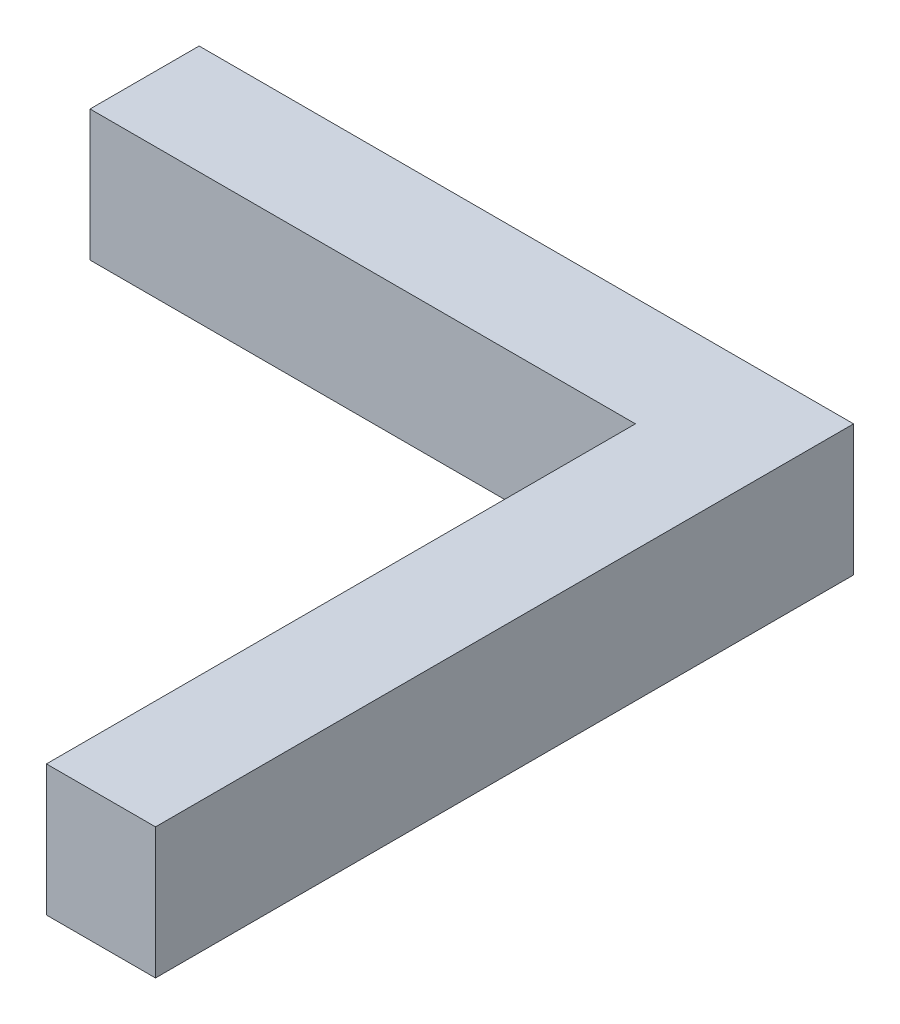
ISO-10303-21;
HEADER;
FILE_DESCRIPTION(('STEP AP214'),'2;1');
FILE_NAME('part.step','',(''),(''),'','','');
FILE_SCHEMA(('AUTOMOTIVE_DESIGN { 1 0 10303 214 1 1 1 1 }'));
ENDSEC;
DATA;
#1=APPLICATION_CONTEXT('core data for automotive mechanical design processes');
#2=APPLICATION_PROTOCOL_DEFINITION('international standard','automotive_design',2000,#1);
#3=PRODUCT_CONTEXT('',#1,'mechanical');
#4=PRODUCT('Part','Part','',(#3));
#5=PRODUCT_RELATED_PRODUCT_CATEGORY('part','',(#4));
#6=PRODUCT_DEFINITION_FORMATION('','',#4);
#7=PRODUCT_DEFINITION_CONTEXT('part definition',#1,'design');
#8=PRODUCT_DEFINITION('design','',#6,#7);
#9=PRODUCT_DEFINITION_SHAPE('','',#8);
#10=(LENGTH_UNIT() NAMED_UNIT(*) SI_UNIT(.MILLI.,.METRE.));
#11=(NAMED_UNIT(*) PLANE_ANGLE_UNIT() SI_UNIT($,.RADIAN.));
#12=(NAMED_UNIT(*) SI_UNIT($,.STERADIAN.) SOLID_ANGLE_UNIT());
#13=UNCERTAINTY_MEASURE_WITH_UNIT(LENGTH_MEASURE(1.E-05),#10,'distance_accuracy_value','');
#14=(GEOMETRIC_REPRESENTATION_CONTEXT(3) GLOBAL_UNCERTAINTY_ASSIGNED_CONTEXT((#13)) GLOBAL_UNIT_ASSIGNED_CONTEXT((#10,
#11,#12)) REPRESENTATION_CONTEXT('',''));
#15=CARTESIAN_POINT('',(0.,0.,0.));
#16=DIRECTION('',(0.,0.,1.));
#17=DIRECTION('',(1.,0.,0.));
#18=AXIS2_PLACEMENT_3D('',#15,#16,#17);
#19=CARTESIAN_POINT('',(0.,12.,10.));
#20=DIRECTION('',(1.,0.,0.));
#21=DIRECTION('',(0.,0.,-1.));
#22=AXIS2_PLACEMENT_3D('',#19,#20,#21);
#23=PLANE('',#22);
#24=DIRECTION('',(0.,0.,1.));
#25=VECTOR('',#24,1.);
#26=CARTESIAN_POINT('',(0.,0.,10.));
#27=LINE('',#26,#25);
#28=CARTESIAN_POINT('',(0.,0.,0.));
#29=VERTEX_POINT('',#28);
#30=CARTESIAN_POINT('',(0.,0.,10.));
#31=VERTEX_POINT('',#30);
#32=EDGE_CURVE('E117',#29,#31,#27,.T.);
#33=ORIENTED_EDGE('',*,*,#32,.T.);
#34=DIRECTION('',(0.,-1.,0.));
#35=VECTOR('',#34,1.);
#36=CARTESIAN_POINT('',(0.,12.,10.));
#37=LINE('',#36,#35);
#38=CARTESIAN_POINT('',(0.,12.,10.));
#39=VERTEX_POINT('',#38);
#40=EDGE_CURVE('E11',#39,#31,#37,.T.);
#41=ORIENTED_EDGE('',*,*,#40,.F.);
#42=DIRECTION('',(0.,0.,1.));
#43=VECTOR('',#42,1.);
#44=CARTESIAN_POINT('',(0.,12.,10.));
#45=LINE('',#44,#43);
#46=CARTESIAN_POINT('',(0.,12.,0.));
#47=VERTEX_POINT('',#46);
#48=EDGE_CURVE('E127',#47,#39,#45,.T.);
#49=ORIENTED_EDGE('',*,*,#48,.F.);
#50=DIRECTION('',(0.,-1.,0.));
#51=VECTOR('',#50,1.);
#52=CARTESIAN_POINT('',(0.,12.,0.));
#53=LINE('',#52,#51);
#54=EDGE_CURVE('E113',#47,#29,#53,.T.);
#55=ORIENTED_EDGE('',*,*,#54,.T.);
#56=EDGE_LOOP('',(#33,#41,#49,#55));
#57=FACE_BOUND('',#56,.T.);
#58=ADVANCED_FACE('F33',(#57),#23,.F.);
#59=CARTESIAN_POINT('',(50.,12.,10.));
#60=DIRECTION('',(0.,0.,-1.));
#61=DIRECTION('',(-1.,0.,0.));
#62=AXIS2_PLACEMENT_3D('',#59,#60,#61);
#63=PLANE('',#62);
#64=DIRECTION('',(1.,0.,0.));
#65=VECTOR('',#64,1.);
#66=CARTESIAN_POINT('',(50.,0.,10.));
#67=LINE('',#66,#65);
#68=CARTESIAN_POINT('',(50.,0.,10.));
#69=VERTEX_POINT('',#68);
#70=EDGE_CURVE('E120',#31,#69,#67,.T.);
#71=ORIENTED_EDGE('',*,*,#70,.T.);
#72=DIRECTION('',(0.,-1.,0.));
#73=VECTOR('',#72,1.);
#74=CARTESIAN_POINT('',(50.,12.,10.));
#75=LINE('',#74,#73);
#76=CARTESIAN_POINT('',(50.,12.,10.));
#77=VERTEX_POINT('',#76);
#78=EDGE_CURVE('E41',#77,#69,#75,.T.);
#79=ORIENTED_EDGE('',*,*,#78,.F.);
#80=DIRECTION('',(1.,0.,0.));
#81=VECTOR('',#80,1.);
#82=CARTESIAN_POINT('',(50.,12.,10.));
#83=LINE('',#82,#81);
#84=EDGE_CURVE('E86',#39,#77,#83,.T.);
#85=ORIENTED_EDGE('',*,*,#84,.F.);
#86=ORIENTED_EDGE('',*,*,#40,.T.);
#87=EDGE_LOOP('',(#71,#79,#85,#86));
#88=FACE_BOUND('',#87,.T.);
#89=ADVANCED_FACE('F151',(#88),#63,.F.);
#90=CARTESIAN_POINT('',(50.,12.,64.));
#91=DIRECTION('',(1.,0.,0.));
#92=DIRECTION('',(0.,0.,-1.));
#93=AXIS2_PLACEMENT_3D('',#90,#91,#92);
#94=PLANE('',#93);
#95=DIRECTION('',(0.,0.,1.));
#96=VECTOR('',#95,1.);
#97=CARTESIAN_POINT('',(50.,0.,64.));
#98=LINE('',#97,#96);
#99=CARTESIAN_POINT('',(50.,0.,64.));
#100=VERTEX_POINT('',#99);
#101=EDGE_CURVE('E122',#69,#100,#98,.T.);
#102=ORIENTED_EDGE('',*,*,#101,.T.);
#103=DIRECTION('',(0.,-1.,0.));
#104=VECTOR('',#103,1.);
#105=CARTESIAN_POINT('',(50.,12.,64.));
#106=LINE('',#105,#104);
#107=CARTESIAN_POINT('',(50.,12.,64.));
#108=VERTEX_POINT('',#107);
#109=EDGE_CURVE('E108',#108,#100,#106,.T.);
#110=ORIENTED_EDGE('',*,*,#109,.F.);
#111=DIRECTION('',(0.,0.,1.));
#112=VECTOR('',#111,1.);
#113=CARTESIAN_POINT('',(50.,12.,64.));
#114=LINE('',#113,#112);
#115=EDGE_CURVE('E99',#77,#108,#114,.T.);
#116=ORIENTED_EDGE('',*,*,#115,.F.);
#117=ORIENTED_EDGE('',*,*,#78,.T.);
#118=EDGE_LOOP('',(#102,#110,#116,#117));
#119=FACE_BOUND('',#118,.T.);
#120=ADVANCED_FACE('F133',(#119),#94,.F.);
#121=CARTESIAN_POINT('',(60.,12.,64.));
#122=DIRECTION('',(0.,0.,-1.));
#123=DIRECTION('',(-1.,0.,0.));
#124=AXIS2_PLACEMENT_3D('',#121,#122,#123);
#125=PLANE('',#124);
#126=DIRECTION('',(1.,0.,0.));
#127=VECTOR('',#126,1.);
#128=CARTESIAN_POINT('',(60.,0.,64.));
#129=LINE('',#128,#127);
#130=CARTESIAN_POINT('',(60.,0.,64.));
#131=VERTEX_POINT('',#130);
#132=EDGE_CURVE('E107',#100,#131,#129,.T.);
#133=ORIENTED_EDGE('',*,*,#132,.T.);
#134=DIRECTION('',(0.,-1.,0.));
#135=VECTOR('',#134,1.);
#136=CARTESIAN_POINT('',(60.,12.,64.));
#137=LINE('',#136,#135);
#138=CARTESIAN_POINT('',(60.,12.,64.));
#139=VERTEX_POINT('',#138);
#140=EDGE_CURVE('E104',#139,#131,#137,.T.);
#141=ORIENTED_EDGE('',*,*,#140,.F.);
#142=DIRECTION('',(1.,0.,0.));
#143=VECTOR('',#142,1.);
#144=CARTESIAN_POINT('',(60.,12.,64.));
#145=LINE('',#144,#143);
#146=EDGE_CURVE('E93',#108,#139,#145,.T.);
#147=ORIENTED_EDGE('',*,*,#146,.F.);
#148=ORIENTED_EDGE('',*,*,#109,.T.);
#149=EDGE_LOOP('',(#133,#141,#147,#148));
#150=FACE_BOUND('',#149,.T.);
#151=ADVANCED_FACE('F105',(#150),#125,.F.);
#152=CARTESIAN_POINT('',(60.,12.,0.));
#153=DIRECTION('',(-1.,0.,0.));
#154=DIRECTION('',(0.,0.,1.));
#155=AXIS2_PLACEMENT_3D('',#152,#153,#154);
#156=PLANE('',#155);
#157=DIRECTION('',(0.,0.,-1.));
#158=VECTOR('',#157,1.);
#159=CARTESIAN_POINT('',(60.,0.,0.));
#160=LINE('',#159,#158);
#161=CARTESIAN_POINT('',(60.,0.,0.));
#162=VERTEX_POINT('',#161);
#163=EDGE_CURVE('E72',#131,#162,#160,.T.);
#164=ORIENTED_EDGE('',*,*,#163,.T.);
#165=DIRECTION('',(0.,-1.,0.));
#166=VECTOR('',#165,1.);
#167=CARTESIAN_POINT('',(60.,12.,0.));
#168=LINE('',#167,#166);
#169=CARTESIAN_POINT('',(60.,12.,0.));
#170=VERTEX_POINT('',#169);
#171=EDGE_CURVE('E109',#170,#162,#168,.T.);
#172=ORIENTED_EDGE('',*,*,#171,.F.);
#173=DIRECTION('',(0.,0.,-1.));
#174=VECTOR('',#173,1.);
#175=CARTESIAN_POINT('',(60.,12.,0.));
#176=LINE('',#175,#174);
#177=EDGE_CURVE('E97',#139,#170,#176,.T.);
#178=ORIENTED_EDGE('',*,*,#177,.F.);
#179=ORIENTED_EDGE('',*,*,#140,.T.);
#180=EDGE_LOOP('',(#164,#172,#178,#179));
#181=FACE_BOUND('',#180,.T.);
#182=ADVANCED_FACE('F111',(#181),#156,.F.);
#183=CARTESIAN_POINT('',(0.,12.,0.));
#184=DIRECTION('',(0.,0.,1.));
#185=DIRECTION('',(1.,0.,0.));
#186=AXIS2_PLACEMENT_3D('',#183,#184,#185);
#187=PLANE('',#186);
#188=DIRECTION('',(-1.,0.,0.));
#189=VECTOR('',#188,1.);
#190=CARTESIAN_POINT('',(0.,0.,0.));
#191=LINE('',#190,#189);
#192=EDGE_CURVE('E78',#162,#29,#191,.T.);
#193=ORIENTED_EDGE('',*,*,#192,.T.);
#194=ORIENTED_EDGE('',*,*,#54,.F.);
#195=DIRECTION('',(-1.,0.,0.));
#196=VECTOR('',#195,1.);
#197=CARTESIAN_POINT('',(0.,12.,0.));
#198=LINE('',#197,#196);
#199=EDGE_CURVE('E49',#170,#47,#198,.T.);
#200=ORIENTED_EDGE('',*,*,#199,.F.);
#201=ORIENTED_EDGE('',*,*,#171,.T.);
#202=EDGE_LOOP('',(#193,#194,#200,#201));
#203=FACE_BOUND('',#202,.T.);
#204=ADVANCED_FACE('F140',(#203),#187,.F.);
#205=CARTESIAN_POINT('',(0.,12.,0.));
#206=DIRECTION('',(0.,-1.,0.));
#207=DIRECTION('',(0.,0.,-1.));
#208=AXIS2_PLACEMENT_3D('',#205,#206,#207);
#209=PLANE('',#208);
#210=ORIENTED_EDGE('',*,*,#48,.T.);
#211=ORIENTED_EDGE('',*,*,#84,.T.);
#212=ORIENTED_EDGE('',*,*,#115,.T.);
#213=ORIENTED_EDGE('',*,*,#146,.T.);
#214=ORIENTED_EDGE('',*,*,#177,.T.);
#215=ORIENTED_EDGE('',*,*,#199,.T.);
#216=EDGE_LOOP('',(#210,#211,#212,#213,#214,#215));
#217=FACE_BOUND('',#216,.T.);
#218=ADVANCED_FACE('F95',(#217),#209,.F.);
#219=CARTESIAN_POINT('',(0.,0.,0.));
#220=DIRECTION('',(0.,-1.,0.));
#221=DIRECTION('',(0.,0.,-1.));
#222=AXIS2_PLACEMENT_3D('',#219,#220,#221);
#223=PLANE('',#222);
#224=ORIENTED_EDGE('',*,*,#32,.F.);
#225=ORIENTED_EDGE('',*,*,#192,.F.);
#226=ORIENTED_EDGE('',*,*,#163,.F.);
#227=ORIENTED_EDGE('',*,*,#132,.F.);
#228=ORIENTED_EDGE('',*,*,#101,.F.);
#229=ORIENTED_EDGE('',*,*,#70,.F.);
#230=EDGE_LOOP('',(#224,#225,#226,#227,#228,#229));
#231=FACE_BOUND('',#230,.T.);
#232=ADVANCED_FACE('F136',(#231),#223,.T.);
#233=CLOSED_SHELL('',(#58,#89,#120,#151,#182,#204,#218,#232));
#234=MANIFOLD_SOLID_BREP('B2',#233);
#235=ADVANCED_BREP_SHAPE_REPRESENTATION('',(#18,#234),#14);
#236=SHAPE_DEFINITION_REPRESENTATION(#9,#235);
ENDSEC;
END-ISO-10303-21;
